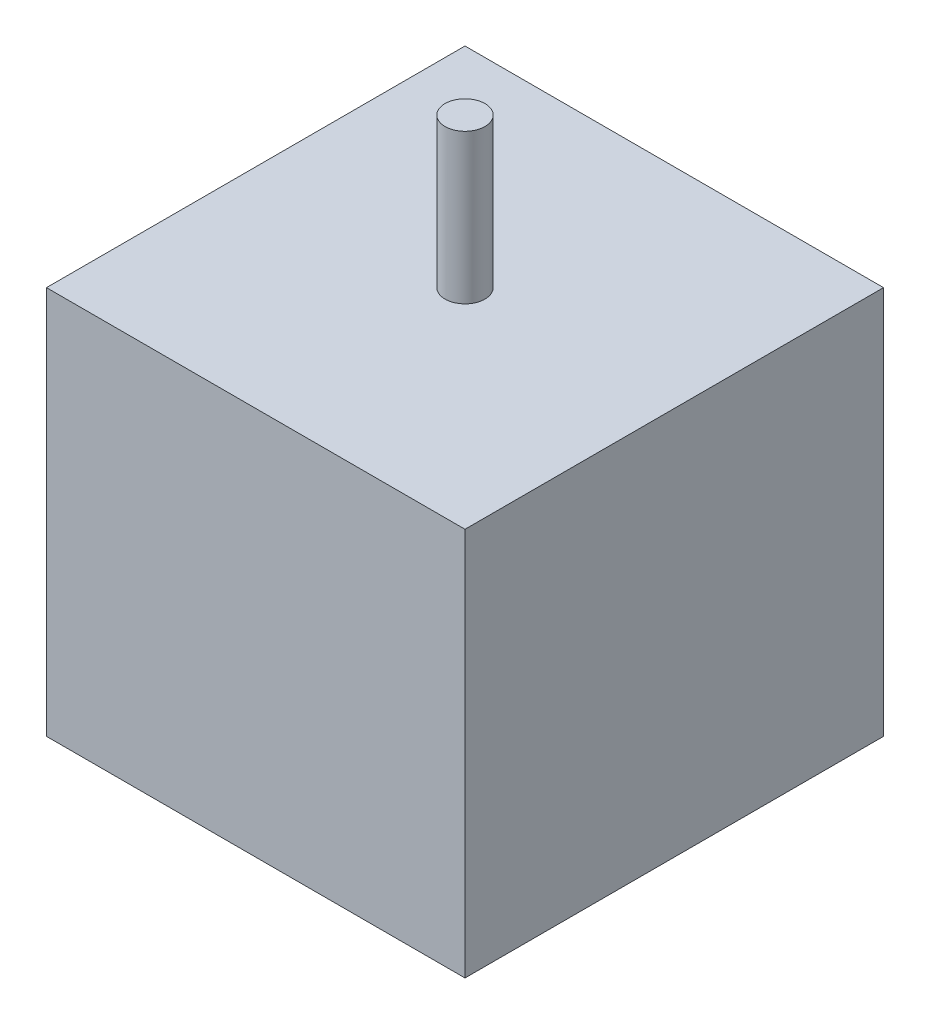
ISO-10303-21;
HEADER;
FILE_DESCRIPTION(('STEP AP214'),'2;1');
FILE_NAME('part.step','',(''),(''),'','','');
FILE_SCHEMA(('AUTOMOTIVE_DESIGN { 1 0 10303 214 1 1 1 1 }'));
ENDSEC;
DATA;
#1=APPLICATION_CONTEXT('core data for automotive mechanical design processes');
#2=APPLICATION_PROTOCOL_DEFINITION('international standard','automotive_design',2000,#1);
#3=PRODUCT_CONTEXT('',#1,'mechanical');
#4=PRODUCT('Part','Part','',(#3));
#5=PRODUCT_RELATED_PRODUCT_CATEGORY('part','',(#4));
#6=PRODUCT_DEFINITION_FORMATION('','',#4);
#7=PRODUCT_DEFINITION_CONTEXT('part definition',#1,'design');
#8=PRODUCT_DEFINITION('design','',#6,#7);
#9=PRODUCT_DEFINITION_SHAPE('','',#8);
#10=(LENGTH_UNIT() NAMED_UNIT(*) SI_UNIT(.MILLI.,.METRE.));
#11=(NAMED_UNIT(*) PLANE_ANGLE_UNIT() SI_UNIT($,.RADIAN.));
#12=(NAMED_UNIT(*) SI_UNIT($,.STERADIAN.) SOLID_ANGLE_UNIT());
#13=UNCERTAINTY_MEASURE_WITH_UNIT(LENGTH_MEASURE(1.E-05),#10,'distance_accuracy_value','');
#14=(GEOMETRIC_REPRESENTATION_CONTEXT(3) GLOBAL_UNCERTAINTY_ASSIGNED_CONTEXT((#13)) GLOBAL_UNIT_ASSIGNED_CONTEXT((#10,
#11,#12)) REPRESENTATION_CONTEXT('',''));
#15=CARTESIAN_POINT('',(0.,0.,0.));
#16=DIRECTION('',(0.,0.,1.));
#17=DIRECTION('',(1.,0.,0.));
#18=AXIS2_PLACEMENT_3D('',#15,#16,#17);
#19=CARTESIAN_POINT('',(21.,39.,21.));
#20=DIRECTION('',(-1.,0.,0.));
#21=DIRECTION('',(0.,0.,1.));
#22=AXIS2_PLACEMENT_3D('',#19,#20,#21);
#23=PLANE('',#22);
#24=DIRECTION('',(0.,0.,-1.));
#25=VECTOR('',#24,1.);
#26=CARTESIAN_POINT('',(21.,0.,21.));
#27=LINE('',#26,#25);
#28=CARTESIAN_POINT('',(21.,0.,21.));
#29=VERTEX_POINT('',#28);
#30=CARTESIAN_POINT('',(21.,0.,-21.));
#31=VERTEX_POINT('',#30);
#32=EDGE_CURVE('E103',#29,#31,#27,.T.);
#33=ORIENTED_EDGE('',*,*,#32,.T.);
#34=DIRECTION('',(0.,-1.,0.));
#35=VECTOR('',#34,1.);
#36=CARTESIAN_POINT('',(21.,39.,-21.));
#37=LINE('',#36,#35);
#38=CARTESIAN_POINT('',(21.,39.,-21.));
#39=VERTEX_POINT('',#38);
#40=EDGE_CURVE('E45',#39,#31,#37,.T.);
#41=ORIENTED_EDGE('',*,*,#40,.F.);
#42=DIRECTION('',(0.,0.,-1.));
#43=VECTOR('',#42,1.);
#44=CARTESIAN_POINT('',(21.,39.,21.));
#45=LINE('',#44,#43);
#46=CARTESIAN_POINT('',(21.,39.,21.));
#47=VERTEX_POINT('',#46);
#48=EDGE_CURVE('E89',#47,#39,#45,.T.);
#49=ORIENTED_EDGE('',*,*,#48,.F.);
#50=DIRECTION('',(0.,-1.,0.));
#51=VECTOR('',#50,1.);
#52=CARTESIAN_POINT('',(21.,39.,21.));
#53=LINE('',#52,#51);
#54=EDGE_CURVE('E99',#47,#29,#53,.T.);
#55=ORIENTED_EDGE('',*,*,#54,.T.);
#56=EDGE_LOOP('',(#33,#41,#49,#55));
#57=FACE_BOUND('',#56,.T.);
#58=ADVANCED_FACE('F37',(#57),#23,.F.);
#59=CARTESIAN_POINT('',(-21.,39.,-21.));
#60=DIRECTION('',(0.,0.,1.));
#61=DIRECTION('',(1.,0.,0.));
#62=AXIS2_PLACEMENT_3D('',#59,#60,#61);
#63=PLANE('',#62);
#64=DIRECTION('',(-1.,0.,0.));
#65=VECTOR('',#64,1.);
#66=CARTESIAN_POINT('',(-21.,0.,-21.));
#67=LINE('',#66,#65);
#68=CARTESIAN_POINT('',(-21.,0.,-21.));
#69=VERTEX_POINT('',#68);
#70=EDGE_CURVE('E94',#31,#69,#67,.T.);
#71=ORIENTED_EDGE('',*,*,#70,.T.);
#72=DIRECTION('',(0.,-1.,0.));
#73=VECTOR('',#72,1.);
#74=CARTESIAN_POINT('',(-21.,39.,-21.));
#75=LINE('',#74,#73);
#76=CARTESIAN_POINT('',(-21.,39.,-21.));
#77=VERTEX_POINT('',#76);
#78=EDGE_CURVE('E92',#77,#69,#75,.T.);
#79=ORIENTED_EDGE('',*,*,#78,.F.);
#80=DIRECTION('',(-1.,0.,0.));
#81=VECTOR('',#80,1.);
#82=CARTESIAN_POINT('',(-21.,39.,-21.));
#83=LINE('',#82,#81);
#84=EDGE_CURVE('E84',#39,#77,#83,.T.);
#85=ORIENTED_EDGE('',*,*,#84,.F.);
#86=ORIENTED_EDGE('',*,*,#40,.T.);
#87=EDGE_LOOP('',(#71,#79,#85,#86));
#88=FACE_BOUND('',#87,.T.);
#89=ADVANCED_FACE('F93',(#88),#63,.F.);
#90=CARTESIAN_POINT('',(-21.,39.,21.));
#91=DIRECTION('',(1.,0.,0.));
#92=DIRECTION('',(0.,0.,-1.));
#93=AXIS2_PLACEMENT_3D('',#90,#91,#92);
#94=PLANE('',#93);
#95=DIRECTION('',(0.,0.,1.));
#96=VECTOR('',#95,1.);
#97=CARTESIAN_POINT('',(-21.,0.,21.));
#98=LINE('',#97,#96);
#99=CARTESIAN_POINT('',(-21.,0.,21.));
#100=VERTEX_POINT('',#99);
#101=EDGE_CURVE('E70',#69,#100,#98,.T.);
#102=ORIENTED_EDGE('',*,*,#101,.T.);
#103=DIRECTION('',(0.,-1.,0.));
#104=VECTOR('',#103,1.);
#105=CARTESIAN_POINT('',(-21.,39.,21.));
#106=LINE('',#105,#104);
#107=CARTESIAN_POINT('',(-21.,39.,21.));
#108=VERTEX_POINT('',#107);
#109=EDGE_CURVE('E95',#108,#100,#106,.T.);
#110=ORIENTED_EDGE('',*,*,#109,.F.);
#111=DIRECTION('',(0.,0.,1.));
#112=VECTOR('',#111,1.);
#113=CARTESIAN_POINT('',(-21.,39.,21.));
#114=LINE('',#113,#112);
#115=EDGE_CURVE('E87',#77,#108,#114,.T.);
#116=ORIENTED_EDGE('',*,*,#115,.F.);
#117=ORIENTED_EDGE('',*,*,#78,.T.);
#118=EDGE_LOOP('',(#102,#110,#116,#117));
#119=FACE_BOUND('',#118,.T.);
#120=ADVANCED_FACE('F97',(#119),#94,.F.);
#121=CARTESIAN_POINT('',(-21.,39.,21.));
#122=DIRECTION('',(0.,0.,-1.));
#123=DIRECTION('',(-1.,0.,0.));
#124=AXIS2_PLACEMENT_3D('',#121,#122,#123);
#125=PLANE('',#124);
#126=DIRECTION('',(1.,0.,0.));
#127=VECTOR('',#126,1.);
#128=CARTESIAN_POINT('',(-21.,0.,21.));
#129=LINE('',#128,#127);
#130=EDGE_CURVE('E76',#100,#29,#129,.T.);
#131=ORIENTED_EDGE('',*,*,#130,.T.);
#132=ORIENTED_EDGE('',*,*,#54,.F.);
#133=DIRECTION('',(1.,0.,0.));
#134=VECTOR('',#133,1.);
#135=CARTESIAN_POINT('',(-21.,39.,21.));
#136=LINE('',#135,#134);
#137=EDGE_CURVE('E53',#108,#47,#136,.T.);
#138=ORIENTED_EDGE('',*,*,#137,.F.);
#139=ORIENTED_EDGE('',*,*,#109,.T.);
#140=EDGE_LOOP('',(#131,#132,#138,#139));
#141=FACE_BOUND('',#140,.T.);
#142=ADVANCED_FACE('F126',(#141),#125,.F.);
#143=CARTESIAN_POINT('',(0.,39.,0.));
#144=DIRECTION('',(0.,-1.,0.));
#145=DIRECTION('',(0.,0.,-1.));
#146=AXIS2_PLACEMENT_3D('',#143,#144,#145);
#147=PLANE('',#146);
#148=CARTESIAN_POINT('',(0.,39.,0.));
#149=DIRECTION('',(0.,-1.,0.));
#150=DIRECTION('',(0.,0.,-1.));
#151=AXIS2_PLACEMENT_3D('',#148,#149,#150);
#152=CIRCLE('',#151,2.);
#153=CARTESIAN_POINT('',(0.,39.,-2.));
#154=VERTEX_POINT('',#153);
#155=EDGE_CURVE('E11',#154,#154,#152,.F.);
#156=ORIENTED_EDGE('',*,*,#155,.F.);
#157=EDGE_LOOP('',(#156));
#158=FACE_BOUND('',#157,.T.);
#159=ORIENTED_EDGE('',*,*,#48,.T.);
#160=ORIENTED_EDGE('',*,*,#84,.T.);
#161=ORIENTED_EDGE('',*,*,#115,.T.);
#162=ORIENTED_EDGE('',*,*,#137,.T.);
#163=EDGE_LOOP('',(#159,#160,#161,#162));
#164=FACE_BOUND('',#163,.T.);
#165=ADVANCED_FACE('F85',(#158,#164),#147,.F.);
#166=CARTESIAN_POINT('',(0.,0.,0.));
#167=DIRECTION('',(0.,-1.,0.));
#168=DIRECTION('',(0.,0.,-1.));
#169=AXIS2_PLACEMENT_3D('',#166,#167,#168);
#170=PLANE('',#169);
#171=ORIENTED_EDGE('',*,*,#32,.F.);
#172=ORIENTED_EDGE('',*,*,#130,.F.);
#173=ORIENTED_EDGE('',*,*,#101,.F.);
#174=ORIENTED_EDGE('',*,*,#70,.F.);
#175=EDGE_LOOP('',(#171,#172,#173,#174));
#176=FACE_BOUND('',#175,.T.);
#177=ADVANCED_FACE('F114',(#176),#170,.T.);
#178=CARTESIAN_POINT('',(0.,54.,0.));
#179=DIRECTION('',(0.,-1.,0.));
#180=DIRECTION('',(0.,0.,-1.));
#181=AXIS2_PLACEMENT_3D('',#178,#179,#180);
#182=CYLINDRICAL_SURFACE('',#181,2.);
#183=CARTESIAN_POINT('',(0.,54.,0.));
#184=DIRECTION('',(0.,1.,0.));
#185=DIRECTION('',(0.,0.,1.));
#186=AXIS2_PLACEMENT_3D('',#183,#184,#185);
#187=CIRCLE('',#186,2.);
#188=CARTESIAN_POINT('',(0.,54.,2.));
#189=VERTEX_POINT('',#188);
#190=EDGE_CURVE('E106',#189,#189,#187,.T.);
#191=ORIENTED_EDGE('',*,*,#190,.F.);
#192=EDGE_LOOP('',(#191));
#193=FACE_BOUND('',#192,.T.);
#194=ORIENTED_EDGE('',*,*,#155,.T.);
#195=EDGE_LOOP('',(#194));
#196=FACE_BOUND('',#195,.T.);
#197=ADVANCED_FACE('F116',(#193,#196),#182,.T.);
#198=CARTESIAN_POINT('',(0.,54.,0.));
#199=DIRECTION('',(0.,1.,0.));
#200=DIRECTION('',(0.,0.,1.));
#201=AXIS2_PLACEMENT_3D('',#198,#199,#200);
#202=PLANE('',#201);
#203=ORIENTED_EDGE('',*,*,#190,.T.);
#204=EDGE_LOOP('',(#203));
#205=FACE_BOUND('',#204,.T.);
#206=ADVANCED_FACE('F122',(#205),#202,.T.);
#207=CLOSED_SHELL('',(#58,#89,#120,#142,#165,#177,#197,#206));
#208=MANIFOLD_SOLID_BREP('B2',#207);
#209=ADVANCED_BREP_SHAPE_REPRESENTATION('',(#18,#208),#14);
#210=SHAPE_DEFINITION_REPRESENTATION(#9,#209);
ENDSEC;
END-ISO-10303-21;
